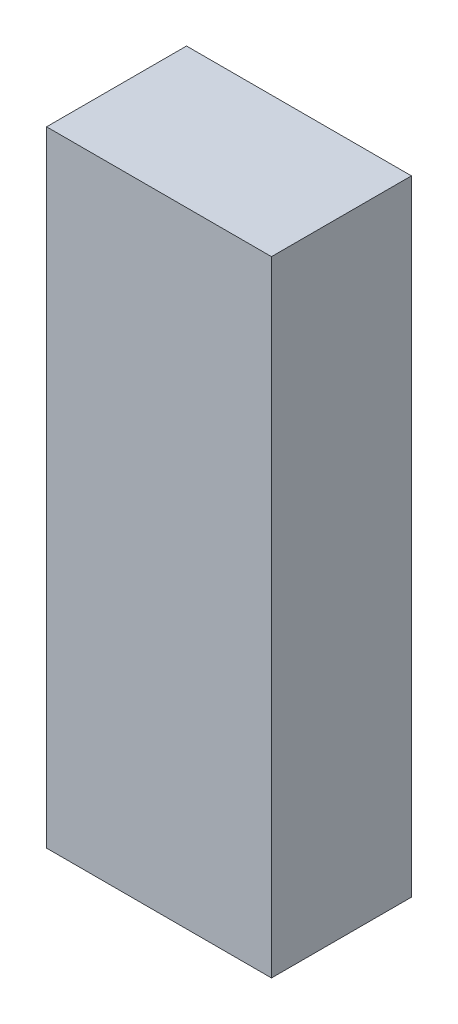
ISO-10303-21;
HEADER;
FILE_DESCRIPTION(('STEP AP214'),'2;1');
FILE_NAME('part.step','',(''),(''),'','','');
FILE_SCHEMA(('AUTOMOTIVE_DESIGN { 1 0 10303 214 1 1 1 1 }'));
ENDSEC;
DATA;
#1=APPLICATION_CONTEXT('core data for automotive mechanical design processes');
#2=APPLICATION_PROTOCOL_DEFINITION('international standard','automotive_design',2000,#1);
#3=PRODUCT_CONTEXT('',#1,'mechanical');
#4=PRODUCT('Part','Part','',(#3));
#5=PRODUCT_RELATED_PRODUCT_CATEGORY('part','',(#4));
#6=PRODUCT_DEFINITION_FORMATION('','',#4);
#7=PRODUCT_DEFINITION_CONTEXT('part definition',#1,'design');
#8=PRODUCT_DEFINITION('design','',#6,#7);
#9=PRODUCT_DEFINITION_SHAPE('','',#8);
#10=(LENGTH_UNIT() NAMED_UNIT(*) SI_UNIT(.MILLI.,.METRE.));
#11=(NAMED_UNIT(*) PLANE_ANGLE_UNIT() SI_UNIT($,.RADIAN.));
#12=(NAMED_UNIT(*) SI_UNIT($,.STERADIAN.) SOLID_ANGLE_UNIT());
#13=UNCERTAINTY_MEASURE_WITH_UNIT(LENGTH_MEASURE(1.E-05),#10,'distance_accuracy_value','');
#14=(GEOMETRIC_REPRESENTATION_CONTEXT(3) GLOBAL_UNCERTAINTY_ASSIGNED_CONTEXT((#13)) GLOBAL_UNIT_ASSIGNED_CONTEXT((#10,
#11,#12)) REPRESENTATION_CONTEXT('',''));
#15=CARTESIAN_POINT('',(0.,0.,0.));
#16=DIRECTION('',(0.,0.,1.));
#17=DIRECTION('',(1.,0.,0.));
#18=AXIS2_PLACEMENT_3D('',#15,#16,#17);
#19=CARTESIAN_POINT('',(-22.5,125.,14.));
#20=DIRECTION('',(1.,0.,0.));
#21=DIRECTION('',(0.,0.,-1.));
#22=AXIS2_PLACEMENT_3D('',#19,#20,#21);
#23=PLANE('',#22);
#24=DIRECTION('',(0.,0.,1.));
#25=VECTOR('',#24,1.);
#26=CARTESIAN_POINT('',(-22.5,0.,14.));
#27=LINE('',#26,#25);
#28=CARTESIAN_POINT('',(-22.5,0.,-14.));
#29=VERTEX_POINT('',#28);
#30=CARTESIAN_POINT('',(-22.5,0.,14.));
#31=VERTEX_POINT('',#30);
#32=EDGE_CURVE('E99',#29,#31,#27,.T.);
#33=ORIENTED_EDGE('',*,*,#32,.T.);
#34=DIRECTION('',(0.,-1.,0.));
#35=VECTOR('',#34,1.);
#36=CARTESIAN_POINT('',(-22.5,125.,14.));
#37=LINE('',#36,#35);
#38=CARTESIAN_POINT('',(-22.5,125.,14.));
#39=VERTEX_POINT('',#38);
#40=EDGE_CURVE('E11',#39,#31,#37,.T.);
#41=ORIENTED_EDGE('',*,*,#40,.F.);
#42=DIRECTION('',(0.,0.,1.));
#43=VECTOR('',#42,1.);
#44=CARTESIAN_POINT('',(-22.5,125.,14.));
#45=LINE('',#44,#43);
#46=CARTESIAN_POINT('',(-22.5,125.,-14.));
#47=VERTEX_POINT('',#46);
#48=EDGE_CURVE('E87',#47,#39,#45,.T.);
#49=ORIENTED_EDGE('',*,*,#48,.F.);
#50=DIRECTION('',(0.,-1.,0.));
#51=VECTOR('',#50,1.);
#52=CARTESIAN_POINT('',(-22.5,125.,-14.));
#53=LINE('',#52,#51);
#54=EDGE_CURVE('E95',#47,#29,#53,.T.);
#55=ORIENTED_EDGE('',*,*,#54,.T.);
#56=EDGE_LOOP('',(#33,#41,#49,#55));
#57=FACE_BOUND('',#56,.T.);
#58=ADVANCED_FACE('F36',(#57),#23,.F.);
#59=CARTESIAN_POINT('',(22.5,125.,14.));
#60=DIRECTION('',(0.,0.,-1.));
#61=DIRECTION('',(-1.,0.,0.));
#62=AXIS2_PLACEMENT_3D('',#59,#60,#61);
#63=PLANE('',#62);
#64=DIRECTION('',(1.,0.,0.));
#65=VECTOR('',#64,1.);
#66=CARTESIAN_POINT('',(22.5,0.,14.));
#67=LINE('',#66,#65);
#68=CARTESIAN_POINT('',(22.5,0.,14.));
#69=VERTEX_POINT('',#68);
#70=EDGE_CURVE('E91',#31,#69,#67,.T.);
#71=ORIENTED_EDGE('',*,*,#70,.T.);
#72=DIRECTION('',(0.,-1.,0.));
#73=VECTOR('',#72,1.);
#74=CARTESIAN_POINT('',(22.5,125.,14.));
#75=LINE('',#74,#73);
#76=CARTESIAN_POINT('',(22.5,125.,14.));
#77=VERTEX_POINT('',#76);
#78=EDGE_CURVE('E44',#77,#69,#75,.T.);
#79=ORIENTED_EDGE('',*,*,#78,.F.);
#80=DIRECTION('',(1.,0.,0.));
#81=VECTOR('',#80,1.);
#82=CARTESIAN_POINT('',(22.5,125.,14.));
#83=LINE('',#82,#81);
#84=EDGE_CURVE('E82',#39,#77,#83,.T.);
#85=ORIENTED_EDGE('',*,*,#84,.F.);
#86=ORIENTED_EDGE('',*,*,#40,.T.);
#87=EDGE_LOOP('',(#71,#79,#85,#86));
#88=FACE_BOUND('',#87,.T.);
#89=ADVANCED_FACE('F90',(#88),#63,.F.);
#90=CARTESIAN_POINT('',(22.5,125.,14.));
#91=DIRECTION('',(-1.,0.,0.));
#92=DIRECTION('',(0.,0.,1.));
#93=AXIS2_PLACEMENT_3D('',#90,#91,#92);
#94=PLANE('',#93);
#95=DIRECTION('',(0.,0.,-1.));
#96=VECTOR('',#95,1.);
#97=CARTESIAN_POINT('',(22.5,0.,14.));
#98=LINE('',#97,#96);
#99=CARTESIAN_POINT('',(22.5,0.,-14.));
#100=VERTEX_POINT('',#99);
#101=EDGE_CURVE('E69',#69,#100,#98,.T.);
#102=ORIENTED_EDGE('',*,*,#101,.T.);
#103=DIRECTION('',(0.,-1.,0.));
#104=VECTOR('',#103,1.);
#105=CARTESIAN_POINT('',(22.5,125.,-14.));
#106=LINE('',#105,#104);
#107=CARTESIAN_POINT('',(22.5,125.,-14.));
#108=VERTEX_POINT('',#107);
#109=EDGE_CURVE('E92',#108,#100,#106,.T.);
#110=ORIENTED_EDGE('',*,*,#109,.F.);
#111=DIRECTION('',(0.,0.,-1.));
#112=VECTOR('',#111,1.);
#113=CARTESIAN_POINT('',(22.5,125.,14.));
#114=LINE('',#113,#112);
#115=EDGE_CURVE('E85',#77,#108,#114,.T.);
#116=ORIENTED_EDGE('',*,*,#115,.F.);
#117=ORIENTED_EDGE('',*,*,#78,.T.);
#118=EDGE_LOOP('',(#102,#110,#116,#117));
#119=FACE_BOUND('',#118,.T.);
#120=ADVANCED_FACE('F93',(#119),#94,.F.);
#121=CARTESIAN_POINT('',(22.5,125.,-14.));
#122=DIRECTION('',(0.,0.,1.));
#123=DIRECTION('',(1.,0.,0.));
#124=AXIS2_PLACEMENT_3D('',#121,#122,#123);
#125=PLANE('',#124);
#126=DIRECTION('',(-1.,0.,0.));
#127=VECTOR('',#126,1.);
#128=CARTESIAN_POINT('',(22.5,0.,-14.));
#129=LINE('',#128,#127);
#130=EDGE_CURVE('E75',#100,#29,#129,.T.);
#131=ORIENTED_EDGE('',*,*,#130,.T.);
#132=ORIENTED_EDGE('',*,*,#54,.F.);
#133=DIRECTION('',(-1.,0.,0.));
#134=VECTOR('',#133,1.);
#135=CARTESIAN_POINT('',(22.5,125.,-14.));
#136=LINE('',#135,#134);
#137=EDGE_CURVE('E52',#108,#47,#136,.T.);
#138=ORIENTED_EDGE('',*,*,#137,.F.);
#139=ORIENTED_EDGE('',*,*,#109,.T.);
#140=EDGE_LOOP('',(#131,#132,#138,#139));
#141=FACE_BOUND('',#140,.T.);
#142=ADVANCED_FACE('F106',(#141),#125,.F.);
#143=CARTESIAN_POINT('',(0.,125.,0.));
#144=DIRECTION('',(0.,1.,0.));
#145=DIRECTION('',(0.,0.,1.));
#146=AXIS2_PLACEMENT_3D('',#143,#144,#145);
#147=PLANE('',#146);
#148=ORIENTED_EDGE('',*,*,#48,.T.);
#149=ORIENTED_EDGE('',*,*,#84,.T.);
#150=ORIENTED_EDGE('',*,*,#115,.T.);
#151=ORIENTED_EDGE('',*,*,#137,.T.);
#152=EDGE_LOOP('',(#148,#149,#150,#151));
#153=FACE_BOUND('',#152,.T.);
#154=ADVANCED_FACE('F83',(#153),#147,.T.);
#155=CARTESIAN_POINT('',(0.,0.,0.));
#156=DIRECTION('',(0.,1.,0.));
#157=DIRECTION('',(0.,0.,1.));
#158=AXIS2_PLACEMENT_3D('',#155,#156,#157);
#159=PLANE('',#158);
#160=ORIENTED_EDGE('',*,*,#32,.F.);
#161=ORIENTED_EDGE('',*,*,#130,.F.);
#162=ORIENTED_EDGE('',*,*,#101,.F.);
#163=ORIENTED_EDGE('',*,*,#70,.F.);
#164=EDGE_LOOP('',(#160,#161,#162,#163));
#165=FACE_BOUND('',#164,.T.);
#166=ADVANCED_FACE('F109',(#165),#159,.F.);
#167=CLOSED_SHELL('',(#58,#89,#120,#142,#154,#166));
#168=MANIFOLD_SOLID_BREP('B2',#167);
#169=ADVANCED_BREP_SHAPE_REPRESENTATION('',(#18,#168),#14);
#170=SHAPE_DEFINITION_REPRESENTATION(#9,#169);
ENDSEC;
END-ISO-10303-21;
